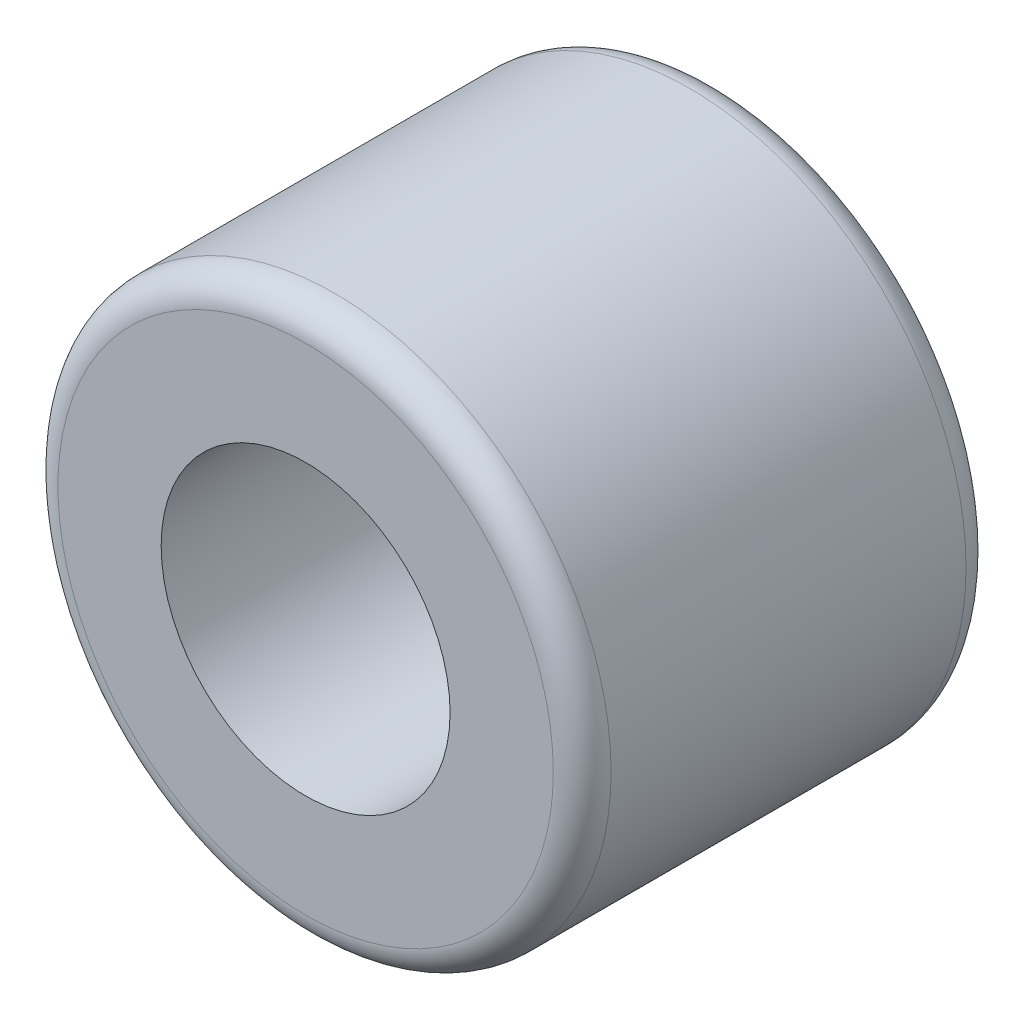
ISO-10303-21;
HEADER;
FILE_DESCRIPTION(('STEP AP214'),'2;1');
FILE_NAME('part.step','',(''),(''),'','','');
FILE_SCHEMA(('AUTOMOTIVE_DESIGN { 1 0 10303 214 1 1 1 1 }'));
ENDSEC;
DATA;
#1=APPLICATION_CONTEXT('core data for automotive mechanical design processes');
#2=APPLICATION_PROTOCOL_DEFINITION('international standard','automotive_design',2000,#1);
#3=PRODUCT_CONTEXT('',#1,'mechanical');
#4=PRODUCT('Part','Part','',(#3));
#5=PRODUCT_RELATED_PRODUCT_CATEGORY('part','',(#4));
#6=PRODUCT_DEFINITION_FORMATION('','',#4);
#7=PRODUCT_DEFINITION_CONTEXT('part definition',#1,'design');
#8=PRODUCT_DEFINITION('design','',#6,#7);
#9=PRODUCT_DEFINITION_SHAPE('','',#8);
#10=(LENGTH_UNIT() NAMED_UNIT(*) SI_UNIT(.MILLI.,.METRE.));
#11=(NAMED_UNIT(*) PLANE_ANGLE_UNIT() SI_UNIT($,.RADIAN.));
#12=(NAMED_UNIT(*) SI_UNIT($,.STERADIAN.) SOLID_ANGLE_UNIT());
#13=UNCERTAINTY_MEASURE_WITH_UNIT(LENGTH_MEASURE(1.E-05),#10,'distance_accuracy_value','');
#14=(GEOMETRIC_REPRESENTATION_CONTEXT(3) GLOBAL_UNCERTAINTY_ASSIGNED_CONTEXT((#13)) GLOBAL_UNIT_ASSIGNED_CONTEXT((#10,
#11,#12)) REPRESENTATION_CONTEXT('',''));
#15=CARTESIAN_POINT('',(0.,0.,0.));
#16=DIRECTION('',(0.,0.,1.));
#17=DIRECTION('',(1.,0.,0.));
#18=AXIS2_PLACEMENT_3D('',#15,#16,#17);
#19=CARTESIAN_POINT('',(0.,0.,12.7));
#20=DIRECTION('',(0.,0.,1.));
#21=DIRECTION('',(1.,0.,0.));
#22=AXIS2_PLACEMENT_3D('',#19,#20,#21);
#23=PLANE('',#22);
#24=CARTESIAN_POINT('',(0.,0.,12.7));
#25=DIRECTION('',(0.,0.,1.));
#26=DIRECTION('',(1.,0.,0.));
#27=AXIS2_PLACEMENT_3D('',#24,#25,#26);
#28=CIRCLE('',#27,7.62);
#29=CARTESIAN_POINT('',(7.62,0.,12.7));
#30=VERTEX_POINT('',#29);
#31=EDGE_CURVE('E10',#30,#30,#28,.T.);
#32=ORIENTED_EDGE('',*,*,#31,.T.);
#33=EDGE_LOOP('',(#32));
#34=FACE_BOUND('',#33,.T.);
#35=CARTESIAN_POINT('',(0.,0.,12.7));
#36=DIRECTION('',(0.,0.,1.));
#37=DIRECTION('',(1.,0.,0.));
#38=AXIS2_PLACEMENT_3D('',#35,#36,#37);
#39=CIRCLE('',#38,4.445);
#40=CARTESIAN_POINT('',(-4.445,0.,12.7));
#41=VERTEX_POINT('',#40);
#42=EDGE_CURVE('E52',#41,#41,#39,.T.);
#43=ORIENTED_EDGE('',*,*,#42,.F.);
#44=EDGE_LOOP('',(#43));
#45=FACE_BOUND('',#44,.T.);
#46=ADVANCED_FACE('F32',(#34,#45),#23,.T.);
#47=CARTESIAN_POINT('',(0.,0.,0.));
#48=DIRECTION('',(0.,0.,1.));
#49=DIRECTION('',(1.,0.,0.));
#50=AXIS2_PLACEMENT_3D('',#47,#48,#49);
#51=PLANE('',#50);
#52=CARTESIAN_POINT('',(0.,0.,0.));
#53=DIRECTION('',(0.,0.,1.));
#54=DIRECTION('',(1.,0.,0.));
#55=AXIS2_PLACEMENT_3D('',#52,#53,#54);
#56=CIRCLE('',#55,7.62);
#57=CARTESIAN_POINT('',(7.62,0.,0.));
#58=VERTEX_POINT('',#57);
#59=EDGE_CURVE('E39',#58,#58,#56,.F.);
#60=ORIENTED_EDGE('',*,*,#59,.T.);
#61=EDGE_LOOP('',(#60));
#62=FACE_BOUND('',#61,.T.);
#63=CARTESIAN_POINT('',(0.,0.,0.));
#64=DIRECTION('',(0.,0.,1.));
#65=DIRECTION('',(1.,0.,0.));
#66=AXIS2_PLACEMENT_3D('',#63,#64,#65);
#67=CIRCLE('',#66,4.445);
#68=CARTESIAN_POINT('',(-4.445,0.,0.));
#69=VERTEX_POINT('',#68);
#70=EDGE_CURVE('E53',#69,#69,#67,.T.);
#71=ORIENTED_EDGE('',*,*,#70,.T.);
#72=EDGE_LOOP('',(#71));
#73=FACE_BOUND('',#72,.T.);
#74=ADVANCED_FACE('F63',(#62,#73),#51,.F.);
#75=CARTESIAN_POINT('',(0.,0.,12.7));
#76=DIRECTION('',(0.,0.,-1.));
#77=DIRECTION('',(-1.,0.,0.));
#78=AXIS2_PLACEMENT_3D('',#75,#76,#77);
#79=CYLINDRICAL_SURFACE('',#78,8.509);
#80=CARTESIAN_POINT('',(0.,0.,0.888999999999999));
#81=DIRECTION('',(0.,0.,1.));
#82=DIRECTION('',(1.,0.,0.));
#83=AXIS2_PLACEMENT_3D('',#80,#81,#82);
#84=CIRCLE('',#83,8.509);
#85=CARTESIAN_POINT('',(-8.509,0.,0.888999999999997));
#86=VERTEX_POINT('',#85);
#87=EDGE_CURVE('E43',#86,#86,#84,.T.);
#88=CARTESIAN_POINT('',(0.,0.,11.811));
#89=DIRECTION('',(0.,0.,1.));
#90=DIRECTION('',(1.,0.,0.));
#91=AXIS2_PLACEMENT_3D('',#88,#89,#90);
#92=CIRCLE('',#91,8.509);
#93=CARTESIAN_POINT('',(-8.509,0.,11.811));
#94=VERTEX_POINT('',#93);
#95=EDGE_CURVE('E47',#94,#94,#92,.F.);
#96=CARTESIAN_POINT('',(-8.509,0.,0.888999999999997));
#97=CARTESIAN_POINT('',(-8.509,0.,1.00277083333333));
#98=CARTESIAN_POINT('',(-8.509,0.,1.11654166666666));
#99=CARTESIAN_POINT('',(-8.509,0.,1.34408333333333));
#100=CARTESIAN_POINT('',(-8.509,0.,1.45785416666666));
#101=CARTESIAN_POINT('',(-8.509,0.,1.68539583333333));
#102=CARTESIAN_POINT('',(-8.509,0.,1.79916666666666));
#103=CARTESIAN_POINT('',(-8.509,0.,2.02670833333333));
#104=CARTESIAN_POINT('',(-8.509,0.,2.14047916666666));
#105=CARTESIAN_POINT('',(-8.509,0.,2.36802083333333));
#106=CARTESIAN_POINT('',(-8.509,0.,2.48179166666667));
#107=CARTESIAN_POINT('',(-8.509,0.,2.70933333333333));
#108=CARTESIAN_POINT('',(-8.509,0.,2.82310416666667));
#109=CARTESIAN_POINT('',(-8.509,0.,3.05064583333333));
#110=CARTESIAN_POINT('',(-8.509,0.,3.16441666666666));
#111=CARTESIAN_POINT('',(-8.509,0.,3.39195833333333));
#112=CARTESIAN_POINT('',(-8.509,0.,3.50572916666666));
#113=CARTESIAN_POINT('',(-8.509,0.,3.73327083333333));
#114=CARTESIAN_POINT('',(-8.509,0.,3.84704166666667));
#115=CARTESIAN_POINT('',(-8.509,0.,4.07458333333333));
#116=CARTESIAN_POINT('',(-8.509,0.,4.18835416666667));
#117=CARTESIAN_POINT('',(-8.509,0.,4.41589583333333));
#118=CARTESIAN_POINT('',(-8.509,0.,4.52966666666667));
#119=CARTESIAN_POINT('',(-8.509,0.,4.75720833333333));
#120=CARTESIAN_POINT('',(-8.509,0.,4.87097916666667));
#121=CARTESIAN_POINT('',(-8.509,0.,5.09852083333333));
#122=CARTESIAN_POINT('',(-8.509,0.,5.21229166666667));
#123=CARTESIAN_POINT('',(-8.509,0.,5.43983333333333));
#124=CARTESIAN_POINT('',(-8.509,0.,5.55360416666667));
#125=CARTESIAN_POINT('',(-8.509,0.,5.78114583333333));
#126=CARTESIAN_POINT('',(-8.509,0.,5.89491666666667));
#127=CARTESIAN_POINT('',(-8.509,0.,6.12245833333333));
#128=CARTESIAN_POINT('',(-8.509,0.,6.23622916666667));
#129=CARTESIAN_POINT('',(-8.509,0.,6.46377083333333));
#130=CARTESIAN_POINT('',(-8.509,0.,6.57754166666667));
#131=CARTESIAN_POINT('',(-8.509,0.,6.80508333333333));
#132=CARTESIAN_POINT('',(-8.509,0.,6.91885416666667));
#133=CARTESIAN_POINT('',(-8.509,0.,7.14639583333333));
#134=CARTESIAN_POINT('',(-8.509,0.,7.26016666666667));
#135=CARTESIAN_POINT('',(-8.509,0.,7.48770833333333));
#136=CARTESIAN_POINT('',(-8.509,0.,7.60147916666667));
#137=CARTESIAN_POINT('',(-8.509,0.,7.82902083333333));
#138=CARTESIAN_POINT('',(-8.509,0.,7.94279166666667));
#139=CARTESIAN_POINT('',(-8.509,0.,8.17033333333333));
#140=CARTESIAN_POINT('',(-8.509,0.,8.28410416666667));
#141=CARTESIAN_POINT('',(-8.509,0.,8.51164583333333));
#142=CARTESIAN_POINT('',(-8.509,0.,8.62541666666666));
#143=CARTESIAN_POINT('',(-8.509,0.,8.85295833333333));
#144=CARTESIAN_POINT('',(-8.509,0.,8.96672916666667));
#145=CARTESIAN_POINT('',(-8.509,0.,9.19427083333333));
#146=CARTESIAN_POINT('',(-8.509,0.,9.30804166666667));
#147=CARTESIAN_POINT('',(-8.509,0.,9.53558333333333));
#148=CARTESIAN_POINT('',(-8.509,0.,9.64935416666667));
#149=CARTESIAN_POINT('',(-8.509,0.,9.87689583333333));
#150=CARTESIAN_POINT('',(-8.509,0.,9.99066666666667));
#151=CARTESIAN_POINT('',(-8.509,0.,10.2182083333333));
#152=CARTESIAN_POINT('',(-8.509,0.,10.3319791666667));
#153=CARTESIAN_POINT('',(-8.509,0.,10.5595208333333));
#154=CARTESIAN_POINT('',(-8.509,0.,10.6732916666667));
#155=CARTESIAN_POINT('',(-8.509,0.,10.9008333333333));
#156=CARTESIAN_POINT('',(-8.509,0.,11.0146041666667));
#157=CARTESIAN_POINT('',(-8.509,0.,11.2421458333333));
#158=CARTESIAN_POINT('',(-8.509,0.,11.3559166666667));
#159=CARTESIAN_POINT('',(-8.509,0.,11.5834583333333));
#160=CARTESIAN_POINT('',(-8.509,0.,11.6972291666667));
#161=CARTESIAN_POINT('',(-8.509,0.,11.811));
#162=B_SPLINE_CURVE_WITH_KNOTS('',3,(#96,#97,#98,#99,#100,#101,#102,#103,#104,#105,#106,#107,
#108,#109,#110,#111,#112,#113,#114,#115,#116,#117,#118,#119,#120,#121,#122,#123,#124,#125,#126,
#127,#128,#129,#130,#131,#132,#133,#134,#135,#136,#137,#138,#139,#140,#141,#142,#143,#144,#145,
#146,#147,#148,#149,#150,#151,#152,#153,#154,#155,#156,#157,#158,#159,#160,#161),.UNSPECIFIED.,
.F.,.F.,(4,2,2,2,2,2,2,2,2,2,2,2,2,2,2,2,2,2,2,2,2,2,2,2,2,2,2,2,2,2,2,2,4),(0.,0.3413125,
0.682625000000001,1.0239375,1.36525,1.7065625,2.047875,2.3891875,2.7305,3.0718125,3.413125,
3.7544375,4.09575,4.4370625,4.778375,5.1196875,5.461,5.8023125,6.143625,6.4849375,6.82625,
7.1675625,7.508875,7.8501875,8.1915,8.5328125,8.874125,9.2154375,9.55675,9.8980625,10.239375,
10.5806875,10.922),.UNSPECIFIED.);
#163=EDGE_CURVE('BSEAM68',#86,#94,#162,.T.);
#164=ORIENTED_EDGE('',*,*,#87,.T.);
#165=ORIENTED_EDGE('',*,*,#95,.T.);
#166=ORIENTED_EDGE('',*,*,#163,.T.);
#167=ORIENTED_EDGE('',*,*,#163,.F.);
#168=EDGE_LOOP('',(#164,#166,#165,#167));
#169=FACE_BOUND('',#168,.T.);
#170=ADVANCED_FACE('F68',(#169),#79,.T.);
#171=CARTESIAN_POINT('',(0.,0.,12.7));
#172=DIRECTION('',(0.,0.,-1.));
#173=DIRECTION('',(-1.,0.,0.));
#174=AXIS2_PLACEMENT_3D('',#171,#172,#173);
#175=CYLINDRICAL_SURFACE('',#174,4.445);
#176=CARTESIAN_POINT('',(-4.445,0.,12.7));
#177=CARTESIAN_POINT('',(-4.445,0.,12.5677083333333));
#178=CARTESIAN_POINT('',(-4.445,0.,12.4354166666667));
#179=CARTESIAN_POINT('',(-4.445,0.,12.1708333333333));
#180=CARTESIAN_POINT('',(-4.445,0.,12.0385416666667));
#181=CARTESIAN_POINT('',(-4.445,0.,11.7739583333333));
#182=CARTESIAN_POINT('',(-4.445,0.,11.6416666666667));
#183=CARTESIAN_POINT('',(-4.445,0.,11.3770833333333));
#184=CARTESIAN_POINT('',(-4.445,0.,11.2447916666667));
#185=CARTESIAN_POINT('',(-4.445,0.,10.9802083333333));
#186=CARTESIAN_POINT('',(-4.445,0.,10.8479166666667));
#187=CARTESIAN_POINT('',(-4.445,0.,10.5833333333333));
#188=CARTESIAN_POINT('',(-4.445,0.,10.4510416666667));
#189=CARTESIAN_POINT('',(-4.445,0.,10.1864583333333));
#190=CARTESIAN_POINT('',(-4.445,0.,10.0541666666667));
#191=CARTESIAN_POINT('',(-4.445,0.,9.78958333333333));
#192=CARTESIAN_POINT('',(-4.445,0.,9.65729166666667));
#193=CARTESIAN_POINT('',(-4.445,0.,9.39270833333333));
#194=CARTESIAN_POINT('',(-4.445,0.,9.26041666666667));
#195=CARTESIAN_POINT('',(-4.445,0.,8.99583333333334));
#196=CARTESIAN_POINT('',(-4.445,0.,8.86354166666667));
#197=CARTESIAN_POINT('',(-4.445,0.,8.59895833333334));
#198=CARTESIAN_POINT('',(-4.445,0.,8.46666666666667));
#199=CARTESIAN_POINT('',(-4.445,0.,8.20208333333333));
#200=CARTESIAN_POINT('',(-4.445,0.,8.06979166666667));
#201=CARTESIAN_POINT('',(-4.445,0.,7.80520833333333));
#202=CARTESIAN_POINT('',(-4.445,0.,7.67291666666667));
#203=CARTESIAN_POINT('',(-4.445,0.,7.40833333333333));
#204=CARTESIAN_POINT('',(-4.445,0.,7.27604166666667));
#205=CARTESIAN_POINT('',(-4.445,0.,7.01145833333333));
#206=CARTESIAN_POINT('',(-4.445,0.,6.87916666666667));
#207=CARTESIAN_POINT('',(-4.445,0.,6.61458333333333));
#208=CARTESIAN_POINT('',(-4.445,0.,6.48229166666667));
#209=CARTESIAN_POINT('',(-4.445,0.,6.21770833333333));
#210=CARTESIAN_POINT('',(-4.445,0.,6.08541666666667));
#211=CARTESIAN_POINT('',(-4.445,0.,5.82083333333333));
#212=CARTESIAN_POINT('',(-4.445,0.,5.68854166666667));
#213=CARTESIAN_POINT('',(-4.445,0.,5.42395833333333));
#214=CARTESIAN_POINT('',(-4.445,0.,5.29166666666667));
#215=CARTESIAN_POINT('',(-4.445,0.,5.02708333333333));
#216=CARTESIAN_POINT('',(-4.445,0.,4.89479166666667));
#217=CARTESIAN_POINT('',(-4.445,0.,4.63020833333333));
#218=CARTESIAN_POINT('',(-4.445,0.,4.49791666666667));
#219=CARTESIAN_POINT('',(-4.445,0.,4.23333333333333));
#220=CARTESIAN_POINT('',(-4.445,0.,4.10104166666667));
#221=CARTESIAN_POINT('',(-4.445,0.,3.83645833333333));
#222=CARTESIAN_POINT('',(-4.445,0.,3.70416666666667));
#223=CARTESIAN_POINT('',(-4.445,0.,3.43958333333333));
#224=CARTESIAN_POINT('',(-4.445,0.,3.30729166666667));
#225=CARTESIAN_POINT('',(-4.445,0.,3.04270833333333));
#226=CARTESIAN_POINT('',(-4.445,0.,2.91041666666667));
#227=CARTESIAN_POINT('',(-4.445,0.,2.64583333333333));
#228=CARTESIAN_POINT('',(-4.445,0.,2.51354166666667));
#229=CARTESIAN_POINT('',(-4.445,0.,2.24895833333333));
#230=CARTESIAN_POINT('',(-4.445,0.,2.11666666666667));
#231=CARTESIAN_POINT('',(-4.445,0.,1.85208333333333));
#232=CARTESIAN_POINT('',(-4.445,0.,1.71979166666667));
#233=CARTESIAN_POINT('',(-4.445,0.,1.45520833333333));
#234=CARTESIAN_POINT('',(-4.445,0.,1.32291666666667));
#235=CARTESIAN_POINT('',(-4.445,0.,1.05833333333333));
#236=CARTESIAN_POINT('',(-4.445,0.,0.926041666666666));
#237=CARTESIAN_POINT('',(-4.445,0.,0.661458333333333));
#238=CARTESIAN_POINT('',(-4.445,0.,0.529166666666666));
#239=CARTESIAN_POINT('',(-4.445,0.,0.264583333333333));
#240=CARTESIAN_POINT('',(-4.445,0.,0.132291666666667));
#241=CARTESIAN_POINT('',(-4.445,0.,0.));
#242=B_SPLINE_CURVE_WITH_KNOTS('',3,(#176,#177,#178,#179,#180,#181,#182,#183,#184,#185,#186,
#187,#188,#189,#190,#191,#192,#193,#194,#195,#196,#197,#198,#199,#200,#201,#202,#203,#204,#205,
#206,#207,#208,#209,#210,#211,#212,#213,#214,#215,#216,#217,#218,#219,#220,#221,#222,#223,#224,
#225,#226,#227,#228,#229,#230,#231,#232,#233,#234,#235,#236,#237,#238,#239,#240,#241),
.UNSPECIFIED.,.F.,.F.,(4,2,2,2,2,2,2,2,2,2,2,2,2,2,2,2,2,2,2,2,2,2,2,2,2,2,2,2,2,2,2,2,4),(0.,
0.396875,0.793749999999999,1.190625,1.5875,1.984375,2.38125,2.778125,3.175,3.571875,3.96875,
4.365625,4.7625,5.159375,5.55625,5.953125,6.35,6.746875,7.14375,7.540625,7.9375,8.334375,
8.73125,9.128125,9.525,9.921875,10.31875,10.715625,11.1125,11.509375,11.90625,12.303125,12.7),.UNSPECIFIED.);
#243=EDGE_CURVE('BSEAM59',#41,#69,#242,.T.);
#244=ORIENTED_EDGE('',*,*,#42,.T.);
#245=ORIENTED_EDGE('',*,*,#70,.F.);
#246=ORIENTED_EDGE('',*,*,#243,.T.);
#247=ORIENTED_EDGE('',*,*,#243,.F.);
#248=EDGE_LOOP('',(#244,#246,#245,#247));
#249=FACE_BOUND('',#248,.T.);
#250=ADVANCED_FACE('F59',(#249),#175,.F.);
#251=CARTESIAN_POINT('',(0.,0.,0.888999999999999));
#252=DIRECTION('',(0.,0.,1.));
#253=DIRECTION('',(1.,0.,0.));
#254=AXIS2_PLACEMENT_3D('',#251,#252,#253);
#255=TOROIDAL_SURFACE('',#254,7.62,0.889);
#256=ORIENTED_EDGE('',*,*,#59,.F.);
#257=EDGE_LOOP('',(#256));
#258=FACE_BOUND('',#257,.T.);
#259=ORIENTED_EDGE('',*,*,#87,.F.);
#260=EDGE_LOOP('',(#259));
#261=FACE_BOUND('',#260,.T.);
#262=ADVANCED_FACE('F74',(#258,#261),#255,.T.);
#263=CARTESIAN_POINT('',(0.,0.,11.811));
#264=DIRECTION('',(0.,0.,1.));
#265=DIRECTION('',(1.,0.,0.));
#266=AXIS2_PLACEMENT_3D('',#263,#264,#265);
#267=TOROIDAL_SURFACE('',#266,7.62,0.889);
#268=ORIENTED_EDGE('',*,*,#95,.F.);
#269=EDGE_LOOP('',(#268));
#270=FACE_BOUND('',#269,.T.);
#271=ORIENTED_EDGE('',*,*,#31,.F.);
#272=EDGE_LOOP('',(#271));
#273=FACE_BOUND('',#272,.T.);
#274=ADVANCED_FACE('F34',(#270,#273),#267,.T.);
#275=CLOSED_SHELL('',(#46,#74,#170,#250,#262,#274));
#276=MANIFOLD_SOLID_BREP('B2',#275);
#277=ADVANCED_BREP_SHAPE_REPRESENTATION('',(#18,#276),#14);
#278=SHAPE_DEFINITION_REPRESENTATION(#9,#277);
ENDSEC;
END-ISO-10303-21;
